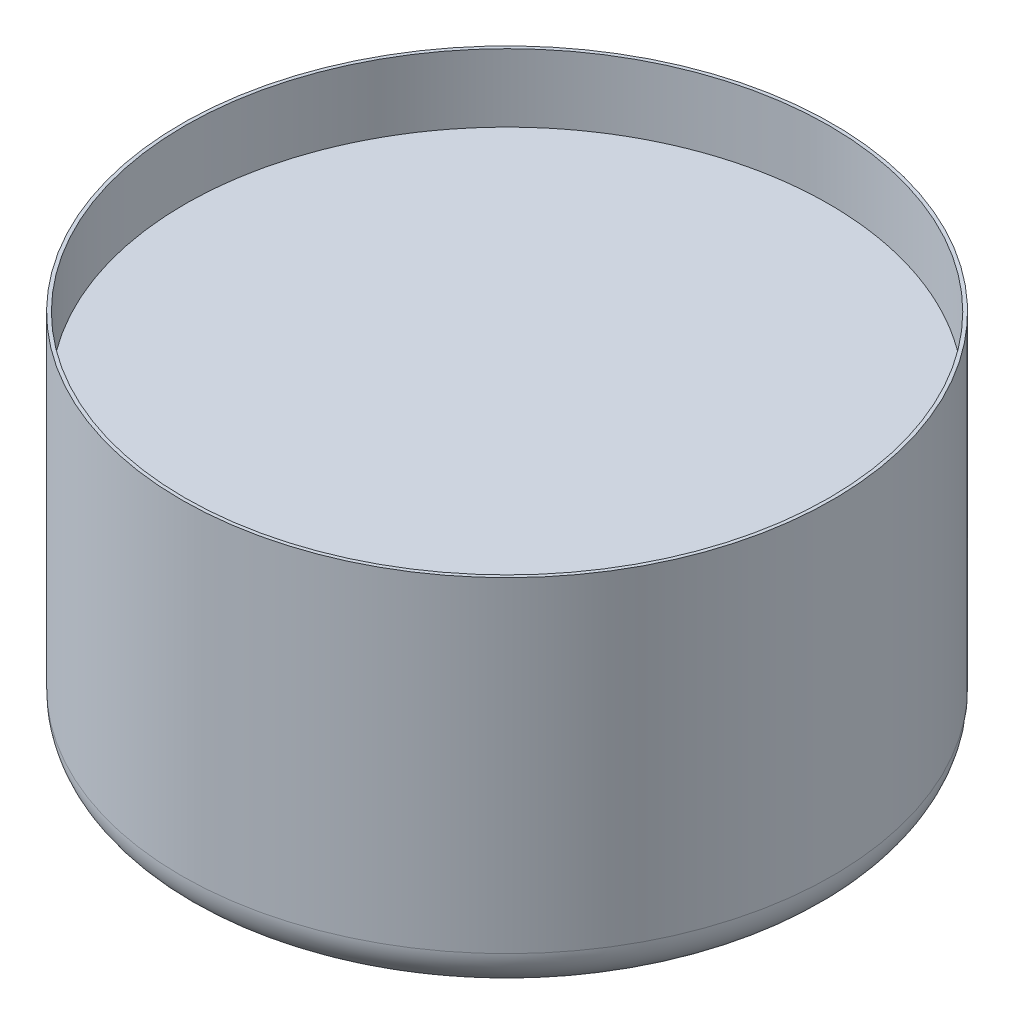
ISO-10303-21;
HEADER;
FILE_DESCRIPTION(('STEP AP214'),'2;1');
FILE_NAME('part.step','',(''),(''),'','','');
FILE_SCHEMA(('AUTOMOTIVE_DESIGN { 1 0 10303 214 1 1 1 1 }'));
ENDSEC;
DATA;
#1=APPLICATION_CONTEXT('core data for automotive mechanical design processes');
#2=APPLICATION_PROTOCOL_DEFINITION('international standard','automotive_design',2000,#1);
#3=PRODUCT_CONTEXT('',#1,'mechanical');
#4=PRODUCT('Part','Part','',(#3));
#5=PRODUCT_RELATED_PRODUCT_CATEGORY('part','',(#4));
#6=PRODUCT_DEFINITION_FORMATION('','',#4);
#7=PRODUCT_DEFINITION_CONTEXT('part definition',#1,'design');
#8=PRODUCT_DEFINITION('design','',#6,#7);
#9=PRODUCT_DEFINITION_SHAPE('','',#8);
#10=(LENGTH_UNIT() NAMED_UNIT(*) SI_UNIT(.MILLI.,.METRE.));
#11=(NAMED_UNIT(*) PLANE_ANGLE_UNIT() SI_UNIT($,.RADIAN.));
#12=(NAMED_UNIT(*) SI_UNIT($,.STERADIAN.) SOLID_ANGLE_UNIT());
#13=UNCERTAINTY_MEASURE_WITH_UNIT(LENGTH_MEASURE(1.E-05),#10,'distance_accuracy_value','');
#14=(GEOMETRIC_REPRESENTATION_CONTEXT(3) GLOBAL_UNCERTAINTY_ASSIGNED_CONTEXT((#13)) GLOBAL_UNIT_ASSIGNED_CONTEXT((#10,
#11,#12)) REPRESENTATION_CONTEXT('',''));
#15=CARTESIAN_POINT('',(0.,0.,0.));
#16=DIRECTION('',(0.,0.,1.));
#17=DIRECTION('',(1.,0.,0.));
#18=AXIS2_PLACEMENT_3D('',#15,#16,#17);
#19=CARTESIAN_POINT('',(0.,6.35,0.));
#20=DIRECTION('',(0.,1.,0.));
#21=DIRECTION('',(0.,0.,1.));
#22=AXIS2_PLACEMENT_3D('',#19,#20,#21);
#23=PLANE('',#22);
#24=CARTESIAN_POINT('',(0.,6.35000000000004,0.));
#25=DIRECTION('',(0.,1.,0.));
#26=DIRECTION('',(0.,0.,1.));
#27=AXIS2_PLACEMENT_3D('',#24,#25,#26);
#28=CIRCLE('',#27,533.4);
#29=CARTESIAN_POINT('',(0.,6.35000000000004,533.4));
#30=VERTEX_POINT('',#29);
#31=EDGE_CURVE('E11',#30,#30,#28,.F.);
#32=ORIENTED_EDGE('',*,*,#31,.T.);
#33=EDGE_LOOP('',(#32));
#34=FACE_BOUND('',#33,.T.);
#35=ADVANCED_FACE('F42',(#34),#23,.F.);
#36=CARTESIAN_POINT('',(0.,76.2,0.));
#37=DIRECTION('',(0.,1.,0.));
#38=DIRECTION('',(0.,0.,1.));
#39=AXIS2_PLACEMENT_3D('',#36,#37,#38);
#40=TOROIDAL_SURFACE('',#39,533.4,69.85);
#41=ORIENTED_EDGE('',*,*,#31,.F.);
#42=EDGE_LOOP('',(#41));
#43=FACE_BOUND('',#42,.T.);
#44=CARTESIAN_POINT('',(0.,76.2,0.));
#45=DIRECTION('',(0.,-1.,0.));
#46=DIRECTION('',(0.,0.,-1.));
#47=AXIS2_PLACEMENT_3D('',#44,#45,#46);
#48=CIRCLE('',#47,603.25);
#49=CARTESIAN_POINT('',(0.,76.2,-603.25));
#50=VERTEX_POINT('',#49);
#51=EDGE_CURVE('E48',#50,#50,#48,.F.);
#52=ORIENTED_EDGE('',*,*,#51,.F.);
#53=EDGE_LOOP('',(#52));
#54=FACE_BOUND('',#53,.T.);
#55=ADVANCED_FACE('F63',(#43,#54),#40,.T.);
#56=CARTESIAN_POINT('',(0.,-0.00199999999994649,0.));
#57=DIRECTION('',(0.,1.,0.));
#58=DIRECTION('',(0.,0.,1.));
#59=AXIS2_PLACEMENT_3D('',#56,#57,#58);
#60=CYLINDRICAL_SURFACE('',#59,603.25);
#61=CARTESIAN_POINT('',(0.,558.8,0.));
#62=DIRECTION('',(0.,1.,0.));
#63=DIRECTION('',(0.,0.,1.));
#64=AXIS2_PLACEMENT_3D('',#61,#62,#63);
#65=CIRCLE('',#64,603.25);
#66=CARTESIAN_POINT('',(0.,558.8,603.25));
#67=VERTEX_POINT('',#66);
#68=EDGE_CURVE('E52',#67,#67,#65,.T.);
#69=ORIENTED_EDGE('',*,*,#68,.F.);
#70=EDGE_LOOP('',(#69));
#71=FACE_BOUND('',#70,.T.);
#72=ORIENTED_EDGE('',*,*,#51,.T.);
#73=EDGE_LOOP('',(#72));
#74=FACE_BOUND('',#73,.T.);
#75=ADVANCED_FACE('F61',(#71,#74),#60,.T.);
#76=CARTESIAN_POINT('',(0.,558.8,0.));
#77=DIRECTION('',(0.,1.,0.));
#78=DIRECTION('',(0.,0.,1.));
#79=AXIS2_PLACEMENT_3D('',#76,#77,#78);
#80=PLANE('',#79);
#81=ORIENTED_EDGE('',*,*,#68,.T.);
#82=EDGE_LOOP('',(#81));
#83=FACE_BOUND('',#82,.T.);
#84=ADVANCED_FACE('F59',(#83),#80,.T.);
#85=CLOSED_SHELL('',(#35,#55,#75,#84));
#86=MANIFOLD_SOLID_BREP('B2',#85);
#87=CARTESIAN_POINT('',(0.,685.8,0.));
#88=DIRECTION('',(0.,-1.,0.));
#89=DIRECTION('',(0.,0.,-1.));
#90=AXIS2_PLACEMENT_3D('',#87,#88,#89);
#91=CYLINDRICAL_SURFACE('',#90,609.6);
#92=CARTESIAN_POINT('',(0.,76.2,0.));
#93=DIRECTION('',(0.,1.,0.));
#94=DIRECTION('',(0.,0.,1.));
#95=AXIS2_PLACEMENT_3D('',#92,#93,#94);
#96=CIRCLE('',#95,609.6);
#97=CARTESIAN_POINT('',(0.,76.2,609.6));
#98=VERTEX_POINT('',#97);
#99=EDGE_CURVE('E104',#98,#98,#96,.T.);
#100=ORIENTED_EDGE('',*,*,#99,.T.);
#101=EDGE_LOOP('',(#100));
#102=FACE_BOUND('',#101,.T.);
#103=CARTESIAN_POINT('',(0.,685.8,0.));
#104=DIRECTION('',(0.,1.,0.));
#105=DIRECTION('',(0.,0.,1.));
#106=AXIS2_PLACEMENT_3D('',#103,#104,#105);
#107=CIRCLE('',#106,609.6);
#108=CARTESIAN_POINT('',(0.,685.8,609.6));
#109=VERTEX_POINT('',#108);
#110=EDGE_CURVE('E108',#109,#109,#107,.T.);
#111=ORIENTED_EDGE('',*,*,#110,.F.);
#112=EDGE_LOOP('',(#111));
#113=FACE_BOUND('',#112,.T.);
#114=ADVANCED_FACE('F97',(#102,#113),#91,.T.);
#115=CARTESIAN_POINT('',(0.,685.8,0.));
#116=DIRECTION('',(0.,1.,0.));
#117=DIRECTION('',(0.,0.,1.));
#118=AXIS2_PLACEMENT_3D('',#115,#116,#117);
#119=PLANE('',#118);
#120=CARTESIAN_POINT('',(0.,685.8,0.));
#121=DIRECTION('',(0.,1.,0.));
#122=DIRECTION('',(0.,0.,1.));
#123=AXIS2_PLACEMENT_3D('',#120,#121,#122);
#124=CIRCLE('',#123,603.25);
#125=CARTESIAN_POINT('',(0.,685.8,603.25));
#126=VERTEX_POINT('',#125);
#127=EDGE_CURVE('E115',#126,#126,#124,.T.);
#128=ORIENTED_EDGE('',*,*,#127,.F.);
#129=EDGE_LOOP('',(#128));
#130=FACE_BOUND('',#129,.T.);
#131=ORIENTED_EDGE('',*,*,#110,.T.);
#132=EDGE_LOOP('',(#131));
#133=FACE_BOUND('',#132,.T.);
#134=ADVANCED_FACE('F133',(#130,#133),#119,.T.);
#135=CARTESIAN_POINT('',(0.,0.,0.));
#136=DIRECTION('',(0.,1.,0.));
#137=DIRECTION('',(0.,0.,1.));
#138=AXIS2_PLACEMENT_3D('',#135,#136,#137);
#139=PLANE('',#138);
#140=CARTESIAN_POINT('',(0.,0.,0.));
#141=DIRECTION('',(0.,1.,0.));
#142=DIRECTION('',(0.,0.,1.));
#143=AXIS2_PLACEMENT_3D('',#140,#141,#142);
#144=CIRCLE('',#143,533.4);
#145=CARTESIAN_POINT('',(0.,0.,533.4));
#146=VERTEX_POINT('',#145);
#147=EDGE_CURVE('E41',#146,#146,#144,.F.);
#148=ORIENTED_EDGE('',*,*,#147,.T.);
#149=EDGE_LOOP('',(#148));
#150=FACE_BOUND('',#149,.T.);
#151=ADVANCED_FACE('F136',(#150),#139,.F.);
#152=CARTESIAN_POINT('',(0.,76.2,0.));
#153=DIRECTION('',(0.,1.,0.));
#154=DIRECTION('',(0.,0.,1.));
#155=AXIS2_PLACEMENT_3D('',#152,#153,#154);
#156=TOROIDAL_SURFACE('',#155,533.4,76.2);
#157=ORIENTED_EDGE('',*,*,#147,.F.);
#158=EDGE_LOOP('',(#157));
#159=FACE_BOUND('',#158,.T.);
#160=ORIENTED_EDGE('',*,*,#99,.F.);
#161=EDGE_LOOP('',(#160));
#162=FACE_BOUND('',#161,.T.);
#163=ADVANCED_FACE('F99',(#159,#162),#156,.T.);
#164=CARTESIAN_POINT('',(0.,685.8,0.));
#165=DIRECTION('',(0.,-1.,0.));
#166=DIRECTION('',(0.,0.,-1.));
#167=AXIS2_PLACEMENT_3D('',#164,#165,#166);
#168=CYLINDRICAL_SURFACE('',#167,603.25);
#169=CARTESIAN_POINT('',(0.,76.2,0.));
#170=DIRECTION('',(0.,-1.,0.));
#171=DIRECTION('',(0.,0.,-1.));
#172=AXIS2_PLACEMENT_3D('',#169,#170,#171);
#173=CIRCLE('',#172,603.25);
#174=CARTESIAN_POINT('',(0.,76.2,-603.25));
#175=VERTEX_POINT('',#174);
#176=EDGE_CURVE('E118',#175,#175,#173,.F.);
#177=ORIENTED_EDGE('',*,*,#176,.F.);
#178=EDGE_LOOP('',(#177));
#179=FACE_BOUND('',#178,.T.);
#180=ORIENTED_EDGE('',*,*,#127,.T.);
#181=EDGE_LOOP('',(#180));
#182=FACE_BOUND('',#181,.T.);
#183=ADVANCED_FACE('F126',(#179,#182),#168,.F.);
#184=CARTESIAN_POINT('',(0.,6.35,0.));
#185=DIRECTION('',(0.,1.,0.));
#186=DIRECTION('',(0.,0.,1.));
#187=AXIS2_PLACEMENT_3D('',#184,#185,#186);
#188=PLANE('',#187);
#189=CARTESIAN_POINT('',(0.,6.35000000000004,0.));
#190=DIRECTION('',(0.,1.,0.));
#191=DIRECTION('',(0.,0.,1.));
#192=AXIS2_PLACEMENT_3D('',#189,#190,#191);
#193=CIRCLE('',#192,533.4);
#194=CARTESIAN_POINT('',(0.,6.35000000000004,533.4));
#195=VERTEX_POINT('',#194);
#196=EDGE_CURVE('E112',#195,#195,#193,.F.);
#197=ORIENTED_EDGE('',*,*,#196,.F.);
#198=EDGE_LOOP('',(#197));
#199=FACE_BOUND('',#198,.T.);
#200=ADVANCED_FACE('F129',(#199),#188,.T.);
#201=CARTESIAN_POINT('',(0.,76.2,0.));
#202=DIRECTION('',(0.,1.,0.));
#203=DIRECTION('',(0.,0.,1.));
#204=AXIS2_PLACEMENT_3D('',#201,#202,#203);
#205=TOROIDAL_SURFACE('',#204,533.4,69.85);
#206=ORIENTED_EDGE('',*,*,#196,.T.);
#207=EDGE_LOOP('',(#206));
#208=FACE_BOUND('',#207,.T.);
#209=ORIENTED_EDGE('',*,*,#176,.T.);
#210=EDGE_LOOP('',(#209));
#211=FACE_BOUND('',#210,.T.);
#212=ADVANCED_FACE('F124',(#208,#211),#205,.F.);
#213=CLOSED_SHELL('',(#114,#134,#151,#163,#183,#200,#212));
#214=MANIFOLD_SOLID_BREP('B6',#213);
#215=ADVANCED_BREP_SHAPE_REPRESENTATION('',(#18,#86,#214),#14);
#216=SHAPE_DEFINITION_REPRESENTATION(#9,#215);
ENDSEC;
END-ISO-10303-21;
